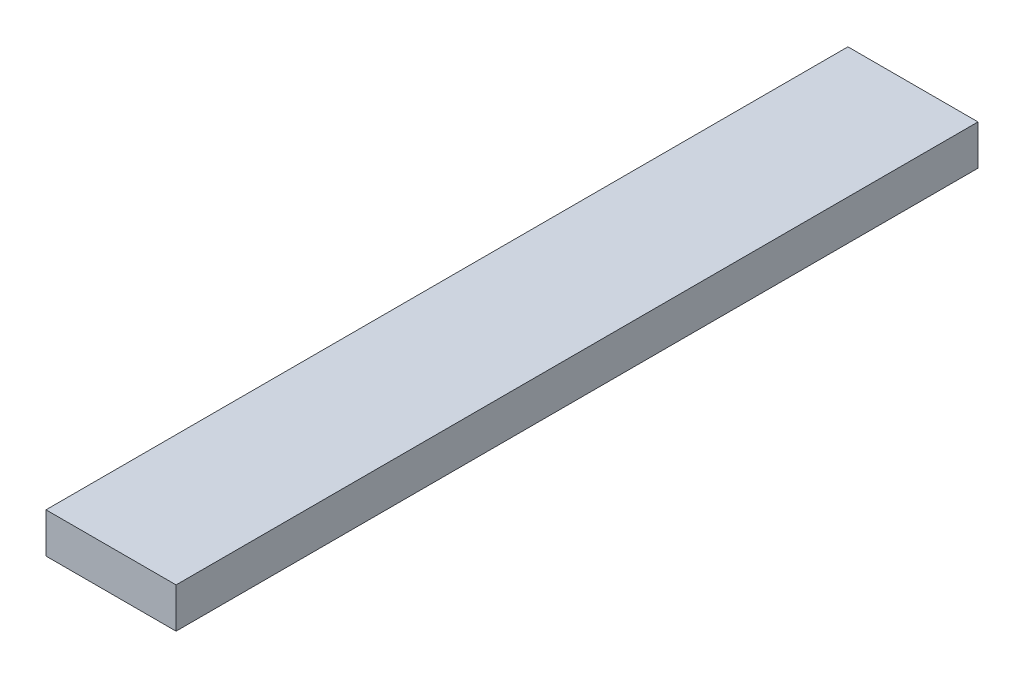
ISO-10303-21;
HEADER;
FILE_DESCRIPTION(('STEP AP214'),'2;1');
FILE_NAME('part.step','',(''),(''),'','','');
FILE_SCHEMA(('AUTOMOTIVE_DESIGN { 1 0 10303 214 1 1 1 1 }'));
ENDSEC;
DATA;
#1=APPLICATION_CONTEXT('core data for automotive mechanical design processes');
#2=APPLICATION_PROTOCOL_DEFINITION('international standard','automotive_design',2000,#1);
#3=PRODUCT_CONTEXT('',#1,'mechanical');
#4=PRODUCT('Part','Part','',(#3));
#5=PRODUCT_RELATED_PRODUCT_CATEGORY('part','',(#4));
#6=PRODUCT_DEFINITION_FORMATION('','',#4);
#7=PRODUCT_DEFINITION_CONTEXT('part definition',#1,'design');
#8=PRODUCT_DEFINITION('design','',#6,#7);
#9=PRODUCT_DEFINITION_SHAPE('','',#8);
#10=(LENGTH_UNIT() NAMED_UNIT(*) SI_UNIT(.MILLI.,.METRE.));
#11=(NAMED_UNIT(*) PLANE_ANGLE_UNIT() SI_UNIT($,.RADIAN.));
#12=(NAMED_UNIT(*) SI_UNIT($,.STERADIAN.) SOLID_ANGLE_UNIT());
#13=UNCERTAINTY_MEASURE_WITH_UNIT(LENGTH_MEASURE(1.E-05),#10,'distance_accuracy_value','');
#14=(GEOMETRIC_REPRESENTATION_CONTEXT(3) GLOBAL_UNCERTAINTY_ASSIGNED_CONTEXT((#13)) GLOBAL_UNIT_ASSIGNED_CONTEXT((#10,
#11,#12)) REPRESENTATION_CONTEXT('',''));
#15=CARTESIAN_POINT('',(0.,0.,0.));
#16=DIRECTION('',(0.,0.,1.));
#17=DIRECTION('',(1.,0.,0.));
#18=AXIS2_PLACEMENT_3D('',#15,#16,#17);
#19=CARTESIAN_POINT('',(0.,6.35,0.));
#20=DIRECTION('',(1.,0.,0.));
#21=DIRECTION('',(0.,0.,-1.));
#22=AXIS2_PLACEMENT_3D('',#19,#20,#21);
#23=PLANE('',#22);
#24=DIRECTION('',(0.,0.,1.));
#25=VECTOR('',#24,1.);
#26=CARTESIAN_POINT('',(0.,0.,0.));
#27=LINE('',#26,#25);
#28=CARTESIAN_POINT('',(0.,0.,0.));
#29=VERTEX_POINT('',#28);
#30=CARTESIAN_POINT('',(0.,0.,127.));
#31=VERTEX_POINT('',#30);
#32=EDGE_CURVE('E111',#29,#31,#27,.T.);
#33=ORIENTED_EDGE('',*,*,#32,.T.);
#34=DIRECTION('',(0.,-1.,0.));
#35=VECTOR('',#34,1.);
#36=CARTESIAN_POINT('',(0.,6.35,127.));
#37=LINE('',#36,#35);
#38=CARTESIAN_POINT('',(0.,6.35,127.));
#39=VERTEX_POINT('',#38);
#40=EDGE_CURVE('E11',#39,#31,#37,.T.);
#41=ORIENTED_EDGE('',*,*,#40,.F.);
#42=DIRECTION('',(0.,0.,1.));
#43=VECTOR('',#42,1.);
#44=CARTESIAN_POINT('',(0.,6.35,0.));
#45=LINE('',#44,#43);
#46=CARTESIAN_POINT('',(0.,6.35,0.));
#47=VERTEX_POINT('',#46);
#48=EDGE_CURVE('E95',#47,#39,#45,.T.);
#49=ORIENTED_EDGE('',*,*,#48,.F.);
#50=DIRECTION('',(0.,-1.,0.));
#51=VECTOR('',#50,1.);
#52=CARTESIAN_POINT('',(0.,6.35,0.));
#53=LINE('',#52,#51);
#54=EDGE_CURVE('E107',#47,#29,#53,.T.);
#55=ORIENTED_EDGE('',*,*,#54,.T.);
#56=EDGE_LOOP('',(#33,#41,#49,#55));
#57=FACE_BOUND('',#56,.T.);
#58=ADVANCED_FACE('F43',(#57),#23,.F.);
#59=CARTESIAN_POINT('',(0.,6.35,127.));
#60=DIRECTION('',(0.,0.,-1.));
#61=DIRECTION('',(-1.,0.,0.));
#62=AXIS2_PLACEMENT_3D('',#59,#60,#61);
#63=PLANE('',#62);
#64=DIRECTION('',(1.,0.,0.));
#65=VECTOR('',#64,1.);
#66=CARTESIAN_POINT('',(0.,0.,127.));
#67=LINE('',#66,#65);
#68=CARTESIAN_POINT('',(20.6,0.,127.));
#69=VERTEX_POINT('',#68);
#70=EDGE_CURVE('E100',#31,#69,#67,.T.);
#71=ORIENTED_EDGE('',*,*,#70,.T.);
#72=DIRECTION('',(0.,-1.,0.));
#73=VECTOR('',#72,1.);
#74=CARTESIAN_POINT('',(20.6,6.35,127.));
#75=LINE('',#74,#73);
#76=CARTESIAN_POINT('',(20.6,6.35,127.));
#77=VERTEX_POINT('',#76);
#78=EDGE_CURVE('E52',#77,#69,#75,.T.);
#79=ORIENTED_EDGE('',*,*,#78,.F.);
#80=DIRECTION('',(1.,0.,0.));
#81=VECTOR('',#80,1.);
#82=CARTESIAN_POINT('',(0.,6.35,127.));
#83=LINE('',#82,#81);
#84=EDGE_CURVE('E90',#39,#77,#83,.T.);
#85=ORIENTED_EDGE('',*,*,#84,.F.);
#86=ORIENTED_EDGE('',*,*,#40,.T.);
#87=EDGE_LOOP('',(#71,#79,#85,#86));
#88=FACE_BOUND('',#87,.T.);
#89=ADVANCED_FACE('F99',(#88),#63,.F.);
#90=CARTESIAN_POINT('',(20.6,6.35,0.));
#91=DIRECTION('',(-1.,0.,0.));
#92=DIRECTION('',(0.,0.,1.));
#93=AXIS2_PLACEMENT_3D('',#90,#91,#92);
#94=PLANE('',#93);
#95=DIRECTION('',(0.,0.,-1.));
#96=VECTOR('',#95,1.);
#97=CARTESIAN_POINT('',(20.6,0.,0.));
#98=LINE('',#97,#96);
#99=CARTESIAN_POINT('',(20.6,0.,0.));
#100=VERTEX_POINT('',#99);
#101=EDGE_CURVE('E77',#69,#100,#98,.T.);
#102=ORIENTED_EDGE('',*,*,#101,.T.);
#103=DIRECTION('',(0.,-1.,0.));
#104=VECTOR('',#103,1.);
#105=CARTESIAN_POINT('',(20.6,6.35,0.));
#106=LINE('',#105,#104);
#107=CARTESIAN_POINT('',(20.6,6.35,0.));
#108=VERTEX_POINT('',#107);
#109=EDGE_CURVE('E102',#108,#100,#106,.T.);
#110=ORIENTED_EDGE('',*,*,#109,.F.);
#111=DIRECTION('',(0.,0.,-1.));
#112=VECTOR('',#111,1.);
#113=CARTESIAN_POINT('',(20.6,6.35,0.));
#114=LINE('',#113,#112);
#115=EDGE_CURVE('E93',#77,#108,#114,.T.);
#116=ORIENTED_EDGE('',*,*,#115,.F.);
#117=ORIENTED_EDGE('',*,*,#78,.T.);
#118=EDGE_LOOP('',(#102,#110,#116,#117));
#119=FACE_BOUND('',#118,.T.);
#120=ADVANCED_FACE('F103',(#119),#94,.F.);
#121=CARTESIAN_POINT('',(0.,6.35,0.));
#122=DIRECTION('',(0.,0.,1.));
#123=DIRECTION('',(1.,0.,0.));
#124=AXIS2_PLACEMENT_3D('',#121,#122,#123);
#125=PLANE('',#124);
#126=DIRECTION('',(-1.,0.,0.));
#127=VECTOR('',#126,1.);
#128=CARTESIAN_POINT('',(0.,0.,0.));
#129=LINE('',#128,#127);
#130=EDGE_CURVE('E83',#100,#29,#129,.T.);
#131=ORIENTED_EDGE('',*,*,#130,.T.);
#132=ORIENTED_EDGE('',*,*,#54,.F.);
#133=DIRECTION('',(-1.,0.,0.));
#134=VECTOR('',#133,1.);
#135=CARTESIAN_POINT('',(0.,6.35,0.));
#136=LINE('',#135,#134);
#137=EDGE_CURVE('E60',#108,#47,#136,.T.);
#138=ORIENTED_EDGE('',*,*,#137,.F.);
#139=ORIENTED_EDGE('',*,*,#109,.T.);
#140=EDGE_LOOP('',(#131,#132,#138,#139));
#141=FACE_BOUND('',#140,.T.);
#142=ADVANCED_FACE('F124',(#141),#125,.F.);
#143=CARTESIAN_POINT('',(0.,6.35,0.));
#144=DIRECTION('',(0.,1.,0.));
#145=DIRECTION('',(0.,0.,1.));
#146=AXIS2_PLACEMENT_3D('',#143,#144,#145);
#147=PLANE('',#146);
#148=ORIENTED_EDGE('',*,*,#48,.T.);
#149=ORIENTED_EDGE('',*,*,#84,.T.);
#150=ORIENTED_EDGE('',*,*,#115,.T.);
#151=ORIENTED_EDGE('',*,*,#137,.T.);
#152=EDGE_LOOP('',(#148,#149,#150,#151));
#153=FACE_BOUND('',#152,.T.);
#154=ADVANCED_FACE('F91',(#153),#147,.T.);
#155=CARTESIAN_POINT('',(0.,0.,0.));
#156=DIRECTION('',(0.,1.,0.));
#157=DIRECTION('',(0.,0.,1.));
#158=AXIS2_PLACEMENT_3D('',#155,#156,#157);
#159=PLANE('',#158);
#160=ORIENTED_EDGE('',*,*,#32,.F.);
#161=ORIENTED_EDGE('',*,*,#130,.F.);
#162=ORIENTED_EDGE('',*,*,#101,.F.);
#163=ORIENTED_EDGE('',*,*,#70,.F.);
#164=EDGE_LOOP('',(#160,#161,#162,#163));
#165=FACE_BOUND('',#164,.T.);
#166=ADVANCED_FACE('F127',(#165),#159,.F.);
#167=CLOSED_SHELL('',(#58,#89,#120,#142,#154,#166));
#168=MANIFOLD_SOLID_BREP('B2',#167);
#169=ADVANCED_BREP_SHAPE_REPRESENTATION('',(#18,#168),#14);
#170=SHAPE_DEFINITION_REPRESENTATION(#9,#169);
ENDSEC;
END-ISO-10303-21;
